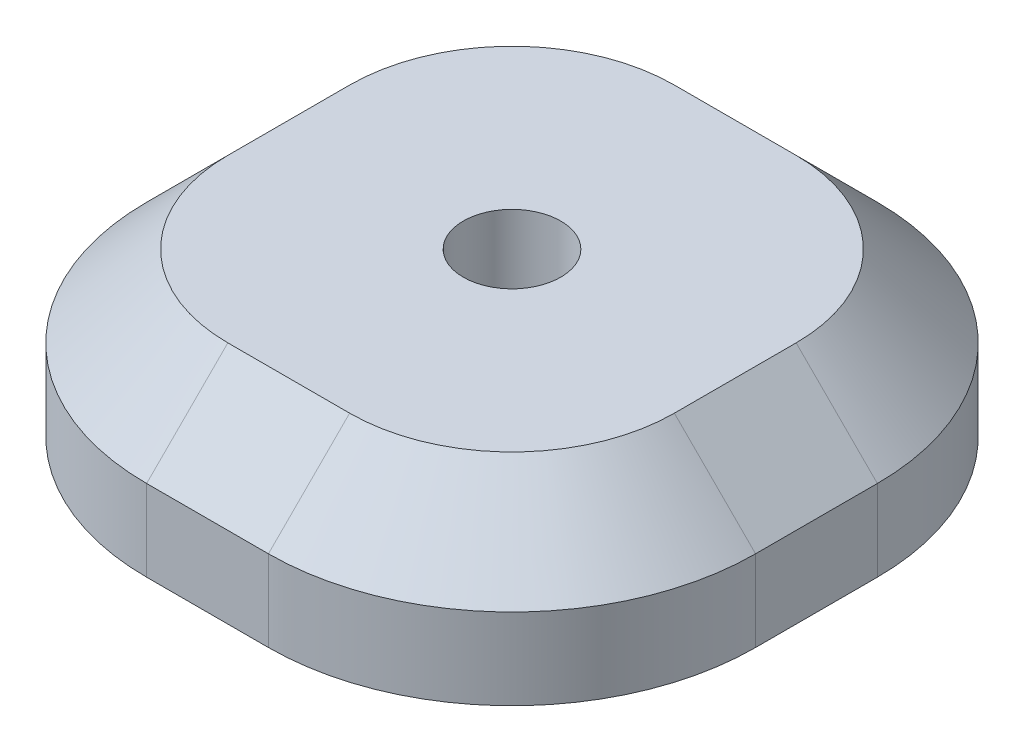
ISO-10303-21;
HEADER;
FILE_DESCRIPTION(('STEP AP214'),'2;1');
FILE_NAME('part.step','',(''),(''),'','','');
FILE_SCHEMA(('AUTOMOTIVE_DESIGN { 1 0 10303 214 1 1 1 1 }'));
ENDSEC;
DATA;
#1=APPLICATION_CONTEXT('core data for automotive mechanical design processes');
#2=APPLICATION_PROTOCOL_DEFINITION('international standard','automotive_design',2000,#1);
#3=PRODUCT_CONTEXT('',#1,'mechanical');
#4=PRODUCT('Part','Part','',(#3));
#5=PRODUCT_RELATED_PRODUCT_CATEGORY('part','',(#4));
#6=PRODUCT_DEFINITION_FORMATION('','',#4);
#7=PRODUCT_DEFINITION_CONTEXT('part definition',#1,'design');
#8=PRODUCT_DEFINITION('design','',#6,#7);
#9=PRODUCT_DEFINITION_SHAPE('','',#8);
#10=(LENGTH_UNIT() NAMED_UNIT(*) SI_UNIT(.MILLI.,.METRE.));
#11=(NAMED_UNIT(*) PLANE_ANGLE_UNIT() SI_UNIT($,.RADIAN.));
#12=(NAMED_UNIT(*) SI_UNIT($,.STERADIAN.) SOLID_ANGLE_UNIT());
#13=UNCERTAINTY_MEASURE_WITH_UNIT(LENGTH_MEASURE(1.E-05),#10,'distance_accuracy_value','');
#14=(GEOMETRIC_REPRESENTATION_CONTEXT(3) GLOBAL_UNCERTAINTY_ASSIGNED_CONTEXT((#13)) GLOBAL_UNIT_ASSIGNED_CONTEXT((#10,
#11,#12)) REPRESENTATION_CONTEXT('',''));
#15=CARTESIAN_POINT('',(0.,0.,0.));
#16=DIRECTION('',(0.,0.,1.));
#17=DIRECTION('',(1.,0.,0.));
#18=AXIS2_PLACEMENT_3D('',#15,#16,#17);
#19=CARTESIAN_POINT('',(7.50000000000001,20.,-7.50000000000002));
#20=DIRECTION('',(0.,-1.,0.));
#21=DIRECTION('',(0.,0.,-1.));
#22=AXIS2_PLACEMENT_3D('',#19,#20,#21);
#23=CYLINDRICAL_SURFACE('',#22,30.);
#24=DIRECTION('',(0.,-1.,0.));
#25=VECTOR('',#24,1.);
#26=CARTESIAN_POINT('',(7.50000000000001,20.,-37.5));
#27=LINE('',#26,#25);
#28=CARTESIAN_POINT('',(7.50000000000001,9.99999999999995,-37.5));
#29=VERTEX_POINT('',#28);
#30=CARTESIAN_POINT('',(7.50000000000001,0.,-37.5));
#31=VERTEX_POINT('',#30);
#32=EDGE_CURVE('E217',#29,#31,#27,.T.);
#33=ORIENTED_EDGE('',*,*,#32,.F.);
#34=CARTESIAN_POINT('',(7.50000000000001,9.99999999999995,-7.50000000000002));
#35=DIRECTION('',(0.,1.,0.));
#36=DIRECTION('',(0.,0.,1.));
#37=AXIS2_PLACEMENT_3D('',#34,#35,#36);
#38=CIRCLE('',#37,30.);
#39=CARTESIAN_POINT('',(37.5,9.99999999999995,-7.50000000000002));
#40=VERTEX_POINT('',#39);
#41=EDGE_CURVE('E241',#29,#40,#38,.F.);
#42=ORIENTED_EDGE('',*,*,#41,.T.);
#43=DIRECTION('',(0.,-1.,0.));
#44=VECTOR('',#43,1.);
#45=CARTESIAN_POINT('',(37.5,20.,-7.50000000000002));
#46=LINE('',#45,#44);
#47=CARTESIAN_POINT('',(37.5,0.,-7.50000000000002));
#48=VERTEX_POINT('',#47);
#49=EDGE_CURVE('E203',#40,#48,#46,.T.);
#50=ORIENTED_EDGE('',*,*,#49,.T.);
#51=CARTESIAN_POINT('',(7.50000000000001,0.,-7.50000000000002));
#52=DIRECTION('',(0.,1.,0.));
#53=DIRECTION('',(0.,0.,1.));
#54=AXIS2_PLACEMENT_3D('',#51,#52,#53);
#55=CIRCLE('',#54,30.);
#56=EDGE_CURVE('E179',#48,#31,#55,.T.);
#57=ORIENTED_EDGE('',*,*,#56,.T.);
#58=EDGE_LOOP('',(#33,#42,#50,#57));
#59=FACE_BOUND('',#58,.T.);
#60=ADVANCED_FACE('F35',(#59),#23,.T.);
#61=CARTESIAN_POINT('',(7.50000000000001,20.,-37.5));
#62=DIRECTION('',(0.,0.,1.));
#63=DIRECTION('',(1.,0.,0.));
#64=AXIS2_PLACEMENT_3D('',#61,#62,#63);
#65=PLANE('',#64);
#66=DIRECTION('',(0.,-1.,0.));
#67=VECTOR('',#66,1.);
#68=CARTESIAN_POINT('',(-7.5,20.,-37.5));
#69=LINE('',#68,#67);
#70=CARTESIAN_POINT('',(-7.5,9.99999999999995,-37.5));
#71=VERTEX_POINT('',#70);
#72=CARTESIAN_POINT('',(-7.5,0.,-37.5));
#73=VERTEX_POINT('',#72);
#74=EDGE_CURVE('E215',#71,#73,#69,.T.);
#75=ORIENTED_EDGE('',*,*,#74,.F.);
#76=DIRECTION('',(1.,0.,0.));
#77=VECTOR('',#76,1.);
#78=CARTESIAN_POINT('',(7.50000000000001,9.99999999999995,-37.5));
#79=LINE('',#78,#77);
#80=EDGE_CURVE('E239',#71,#29,#79,.T.);
#81=ORIENTED_EDGE('',*,*,#80,.T.);
#82=ORIENTED_EDGE('',*,*,#32,.T.);
#83=DIRECTION('',(-1.,0.,0.));
#84=VECTOR('',#83,1.);
#85=CARTESIAN_POINT('',(7.50000000000001,0.,-37.5));
#86=LINE('',#85,#84);
#87=EDGE_CURVE('E182',#31,#73,#86,.T.);
#88=ORIENTED_EDGE('',*,*,#87,.T.);
#89=EDGE_LOOP('',(#75,#81,#82,#88));
#90=FACE_BOUND('',#89,.T.);
#91=ADVANCED_FACE('F344',(#90),#65,.F.);
#92=CARTESIAN_POINT('',(-7.50000000000001,20.,-7.50000000000001));
#93=DIRECTION('',(0.,-1.,0.));
#94=DIRECTION('',(0.,0.,-1.));
#95=AXIS2_PLACEMENT_3D('',#92,#93,#94);
#96=CYLINDRICAL_SURFACE('',#95,30.);
#97=DIRECTION('',(0.,-1.,0.));
#98=VECTOR('',#97,1.);
#99=CARTESIAN_POINT('',(-37.5,20.,-7.50000000000002));
#100=LINE('',#99,#98);
#101=CARTESIAN_POINT('',(-37.5,9.99999999999995,-7.50000000000002));
#102=VERTEX_POINT('',#101);
#103=CARTESIAN_POINT('',(-37.5,0.,-7.50000000000002));
#104=VERTEX_POINT('',#103);
#105=EDGE_CURVE('E213',#102,#104,#100,.T.);
#106=ORIENTED_EDGE('',*,*,#105,.F.);
#107=CARTESIAN_POINT('',(-7.50000000000001,9.99999999999995,-7.50000000000001));
#108=DIRECTION('',(0.,1.,0.));
#109=DIRECTION('',(0.,0.,1.));
#110=AXIS2_PLACEMENT_3D('',#107,#108,#109);
#111=CIRCLE('',#110,30.);
#112=EDGE_CURVE('E236',#102,#71,#111,.F.);
#113=ORIENTED_EDGE('',*,*,#112,.T.);
#114=ORIENTED_EDGE('',*,*,#74,.T.);
#115=CARTESIAN_POINT('',(-7.50000000000001,0.,-7.50000000000001));
#116=DIRECTION('',(0.,1.,0.));
#117=DIRECTION('',(0.,0.,1.));
#118=AXIS2_PLACEMENT_3D('',#115,#116,#117);
#119=CIRCLE('',#118,30.);
#120=EDGE_CURVE('E185',#73,#104,#119,.T.);
#121=ORIENTED_EDGE('',*,*,#120,.T.);
#122=EDGE_LOOP('',(#106,#113,#114,#121));
#123=FACE_BOUND('',#122,.T.);
#124=ADVANCED_FACE('F324',(#123),#96,.T.);
#125=CARTESIAN_POINT('',(-37.5,20.,7.50000000000001));
#126=DIRECTION('',(1.,0.,0.));
#127=DIRECTION('',(0.,0.,-1.));
#128=AXIS2_PLACEMENT_3D('',#125,#126,#127);
#129=PLANE('',#128);
#130=DIRECTION('',(0.,-1.,0.));
#131=VECTOR('',#130,1.);
#132=CARTESIAN_POINT('',(-37.5,20.,7.50000000000001));
#133=LINE('',#132,#131);
#134=CARTESIAN_POINT('',(-37.5,9.99999999999995,7.50000000000001));
#135=VERTEX_POINT('',#134);
#136=CARTESIAN_POINT('',(-37.5,0.,7.50000000000001));
#137=VERTEX_POINT('',#136);
#138=EDGE_CURVE('E211',#135,#137,#133,.T.);
#139=ORIENTED_EDGE('',*,*,#138,.F.);
#140=DIRECTION('',(0.,0.,-1.));
#141=VECTOR('',#140,1.);
#142=CARTESIAN_POINT('',(-37.5,9.99999999999995,-7.50000000000002));
#143=LINE('',#142,#141);
#144=EDGE_CURVE('E11',#135,#102,#143,.T.);
#145=ORIENTED_EDGE('',*,*,#144,.T.);
#146=ORIENTED_EDGE('',*,*,#105,.T.);
#147=DIRECTION('',(0.,0.,1.));
#148=VECTOR('',#147,1.);
#149=CARTESIAN_POINT('',(-37.5,0.,7.50000000000001));
#150=LINE('',#149,#148);
#151=EDGE_CURVE('E188',#104,#137,#150,.T.);
#152=ORIENTED_EDGE('',*,*,#151,.T.);
#153=EDGE_LOOP('',(#139,#145,#146,#152));
#154=FACE_BOUND('',#153,.T.);
#155=ADVANCED_FACE('F321',(#154),#129,.F.);
#156=CARTESIAN_POINT('',(-7.50000000000001,20.,7.50000000000001));
#157=DIRECTION('',(0.,-1.,0.));
#158=DIRECTION('',(0.,0.,-1.));
#159=AXIS2_PLACEMENT_3D('',#156,#157,#158);
#160=CYLINDRICAL_SURFACE('',#159,30.);
#161=DIRECTION('',(0.,-1.,0.));
#162=VECTOR('',#161,1.);
#163=CARTESIAN_POINT('',(-7.50000000000001,20.,37.5));
#164=LINE('',#163,#162);
#165=CARTESIAN_POINT('',(-7.50000000000001,9.99999999999995,37.5));
#166=VERTEX_POINT('',#165);
#167=CARTESIAN_POINT('',(-7.50000000000001,0.,37.5));
#168=VERTEX_POINT('',#167);
#169=EDGE_CURVE('E209',#166,#168,#164,.T.);
#170=ORIENTED_EDGE('',*,*,#169,.F.);
#171=CARTESIAN_POINT('',(-7.50000000000001,9.99999999999995,7.50000000000001));
#172=DIRECTION('',(0.,1.,0.));
#173=DIRECTION('',(0.,0.,1.));
#174=AXIS2_PLACEMENT_3D('',#171,#172,#173);
#175=CIRCLE('',#174,30.);
#176=EDGE_CURVE('E45',#166,#135,#175,.F.);
#177=ORIENTED_EDGE('',*,*,#176,.T.);
#178=ORIENTED_EDGE('',*,*,#138,.T.);
#179=CARTESIAN_POINT('',(-7.50000000000001,0.,7.50000000000001));
#180=DIRECTION('',(0.,1.,0.));
#181=DIRECTION('',(0.,0.,-1.));
#182=AXIS2_PLACEMENT_3D('',#179,#180,#181);
#183=CIRCLE('',#182,30.);
#184=EDGE_CURVE('E191',#137,#168,#183,.T.);
#185=ORIENTED_EDGE('',*,*,#184,.T.);
#186=EDGE_LOOP('',(#170,#177,#178,#185));
#187=FACE_BOUND('',#186,.T.);
#188=ADVANCED_FACE('F355',(#187),#160,.T.);
#189=CARTESIAN_POINT('',(7.50000000000003,20.,37.5));
#190=DIRECTION('',(0.,0.,-1.));
#191=DIRECTION('',(-1.,0.,0.));
#192=AXIS2_PLACEMENT_3D('',#189,#190,#191);
#193=PLANE('',#192);
#194=DIRECTION('',(0.,-1.,0.));
#195=VECTOR('',#194,1.);
#196=CARTESIAN_POINT('',(7.50000000000003,20.,37.5));
#197=LINE('',#196,#195);
#198=CARTESIAN_POINT('',(7.50000000000003,9.99999999999995,37.5));
#199=VERTEX_POINT('',#198);
#200=CARTESIAN_POINT('',(7.50000000000003,0.,37.5));
#201=VERTEX_POINT('',#200);
#202=EDGE_CURVE('E207',#199,#201,#197,.T.);
#203=ORIENTED_EDGE('',*,*,#202,.F.);
#204=DIRECTION('',(-1.,0.,0.));
#205=VECTOR('',#204,1.);
#206=CARTESIAN_POINT('',(-7.50000000000001,9.99999999999995,37.5));
#207=LINE('',#206,#205);
#208=EDGE_CURVE('E60',#199,#166,#207,.T.);
#209=ORIENTED_EDGE('',*,*,#208,.T.);
#210=ORIENTED_EDGE('',*,*,#169,.T.);
#211=DIRECTION('',(1.,0.,0.));
#212=VECTOR('',#211,1.);
#213=CARTESIAN_POINT('',(7.50000000000003,0.,37.5));
#214=LINE('',#213,#212);
#215=EDGE_CURVE('E194',#168,#201,#214,.T.);
#216=ORIENTED_EDGE('',*,*,#215,.T.);
#217=EDGE_LOOP('',(#203,#209,#210,#216));
#218=FACE_BOUND('',#217,.T.);
#219=ADVANCED_FACE('F281',(#218),#193,.F.);
#220=CARTESIAN_POINT('',(7.50000000000003,20.,7.5));
#221=DIRECTION('',(0.,-1.,0.));
#222=DIRECTION('',(0.,0.,-1.));
#223=AXIS2_PLACEMENT_3D('',#220,#221,#222);
#224=CYLINDRICAL_SURFACE('',#223,30.);
#225=DIRECTION('',(0.,-1.,0.));
#226=VECTOR('',#225,1.);
#227=CARTESIAN_POINT('',(37.5,20.,7.5));
#228=LINE('',#227,#226);
#229=CARTESIAN_POINT('',(37.5,9.99999999999995,7.5));
#230=VERTEX_POINT('',#229);
#231=CARTESIAN_POINT('',(37.5,0.,7.5));
#232=VERTEX_POINT('',#231);
#233=EDGE_CURVE('E205',#230,#232,#228,.T.);
#234=ORIENTED_EDGE('',*,*,#233,.F.);
#235=CARTESIAN_POINT('',(7.50000000000003,9.99999999999995,7.5));
#236=DIRECTION('',(0.,1.,0.));
#237=DIRECTION('',(0.,0.,1.));
#238=AXIS2_PLACEMENT_3D('',#235,#236,#237);
#239=CIRCLE('',#238,30.);
#240=EDGE_CURVE('E245',#230,#199,#239,.F.);
#241=ORIENTED_EDGE('',*,*,#240,.T.);
#242=ORIENTED_EDGE('',*,*,#202,.T.);
#243=CARTESIAN_POINT('',(7.50000000000003,0.,7.5));
#244=DIRECTION('',(0.,1.,0.));
#245=DIRECTION('',(0.,0.,1.));
#246=AXIS2_PLACEMENT_3D('',#243,#244,#245);
#247=CIRCLE('',#246,30.);
#248=EDGE_CURVE('E197',#201,#232,#247,.T.);
#249=ORIENTED_EDGE('',*,*,#248,.T.);
#250=EDGE_LOOP('',(#234,#241,#242,#249));
#251=FACE_BOUND('',#250,.T.);
#252=ADVANCED_FACE('F280',(#251),#224,.T.);
#253=CARTESIAN_POINT('',(37.5,20.,7.5));
#254=DIRECTION('',(-1.,0.,0.));
#255=DIRECTION('',(0.,0.,1.));
#256=AXIS2_PLACEMENT_3D('',#253,#254,#255);
#257=PLANE('',#256);
#258=ORIENTED_EDGE('',*,*,#49,.F.);
#259=DIRECTION('',(0.,0.,1.));
#260=VECTOR('',#259,1.);
#261=CARTESIAN_POINT('',(37.5,9.99999999999995,7.5));
#262=LINE('',#261,#260);
#263=EDGE_CURVE('E243',#40,#230,#262,.T.);
#264=ORIENTED_EDGE('',*,*,#263,.T.);
#265=ORIENTED_EDGE('',*,*,#233,.T.);
#266=DIRECTION('',(0.,0.,-1.));
#267=VECTOR('',#266,1.);
#268=CARTESIAN_POINT('',(37.5,0.,7.5));
#269=LINE('',#268,#267);
#270=EDGE_CURVE('E200',#232,#48,#269,.T.);
#271=ORIENTED_EDGE('',*,*,#270,.T.);
#272=EDGE_LOOP('',(#258,#264,#265,#271));
#273=FACE_BOUND('',#272,.T.);
#274=ADVANCED_FACE('F292',(#273),#257,.F.);
#275=CARTESIAN_POINT('',(7.50000000000001,20.,-7.50000000000002));
#276=DIRECTION('',(0.,1.,0.));
#277=DIRECTION('',(0.,0.,1.));
#278=AXIS2_PLACEMENT_3D('',#275,#276,#277);
#279=PLANE('',#278);
#280=CARTESIAN_POINT('',(0.,20.,0.));
#281=DIRECTION('',(0.,1.,0.));
#282=DIRECTION('',(0.,0.,1.));
#283=AXIS2_PLACEMENT_3D('',#280,#281,#282);
#284=CIRCLE('',#283,5.99999999999999);
#285=CARTESIAN_POINT('',(0.,20.,5.99999999999999));
#286=VERTEX_POINT('',#285);
#287=EDGE_CURVE('E150',#286,#286,#284,.T.);
#288=ORIENTED_EDGE('',*,*,#287,.F.);
#289=EDGE_LOOP('',(#288));
#290=FACE_BOUND('',#289,.T.);
#291=DIRECTION('',(-1.,0.,0.));
#292=VECTOR('',#291,1.);
#293=CARTESIAN_POINT('',(-7.5,20.,-27.5));
#294=LINE('',#293,#292);
#295=CARTESIAN_POINT('',(7.50000000000001,20.,-27.5));
#296=VERTEX_POINT('',#295);
#297=CARTESIAN_POINT('',(-7.5,20.,-27.5));
#298=VERTEX_POINT('',#297);
#299=EDGE_CURVE('E231',#296,#298,#294,.T.);
#300=ORIENTED_EDGE('',*,*,#299,.T.);
#301=CARTESIAN_POINT('',(-7.50000000000001,20.,-7.50000000000001));
#302=DIRECTION('',(0.,1.,0.));
#303=DIRECTION('',(0.,0.,1.));
#304=AXIS2_PLACEMENT_3D('',#301,#302,#303);
#305=CIRCLE('',#304,20.);
#306=CARTESIAN_POINT('',(-27.5,20.,-7.50000000000002));
#307=VERTEX_POINT('',#306);
#308=EDGE_CURVE('E233',#298,#307,#305,.T.);
#309=ORIENTED_EDGE('',*,*,#308,.T.);
#310=DIRECTION('',(0.,0.,1.));
#311=VECTOR('',#310,1.);
#312=CARTESIAN_POINT('',(-27.5,20.,7.50000000000002));
#313=LINE('',#312,#311);
#314=CARTESIAN_POINT('',(-27.5,20.,7.50000000000001));
#315=VERTEX_POINT('',#314);
#316=EDGE_CURVE('E219',#307,#315,#313,.T.);
#317=ORIENTED_EDGE('',*,*,#316,.T.);
#318=CARTESIAN_POINT('',(-7.50000000000001,20.,7.50000000000001));
#319=DIRECTION('',(0.,1.,0.));
#320=DIRECTION('',(0.,0.,1.));
#321=AXIS2_PLACEMENT_3D('',#318,#319,#320);
#322=CIRCLE('',#321,20.);
#323=CARTESIAN_POINT('',(-7.50000000000002,20.,27.5));
#324=VERTEX_POINT('',#323);
#325=EDGE_CURVE('E221',#315,#324,#322,.T.);
#326=ORIENTED_EDGE('',*,*,#325,.T.);
#327=DIRECTION('',(1.,0.,0.));
#328=VECTOR('',#327,1.);
#329=CARTESIAN_POINT('',(7.50000000000003,20.,27.5));
#330=LINE('',#329,#328);
#331=CARTESIAN_POINT('',(7.50000000000003,20.,27.5));
#332=VERTEX_POINT('',#331);
#333=EDGE_CURVE('E223',#324,#332,#330,.T.);
#334=ORIENTED_EDGE('',*,*,#333,.T.);
#335=CARTESIAN_POINT('',(7.50000000000003,20.,7.5));
#336=DIRECTION('',(0.,1.,0.));
#337=DIRECTION('',(0.,0.,1.));
#338=AXIS2_PLACEMENT_3D('',#335,#336,#337);
#339=CIRCLE('',#338,20.);
#340=CARTESIAN_POINT('',(27.5,20.,7.5));
#341=VERTEX_POINT('',#340);
#342=EDGE_CURVE('E225',#332,#341,#339,.T.);
#343=ORIENTED_EDGE('',*,*,#342,.T.);
#344=DIRECTION('',(0.,0.,-1.));
#345=VECTOR('',#344,1.);
#346=CARTESIAN_POINT('',(27.5,20.,-7.50000000000002));
#347=LINE('',#346,#345);
#348=CARTESIAN_POINT('',(27.5,20.,-7.50000000000002));
#349=VERTEX_POINT('',#348);
#350=EDGE_CURVE('E227',#341,#349,#347,.T.);
#351=ORIENTED_EDGE('',*,*,#350,.T.);
#352=CARTESIAN_POINT('',(7.50000000000001,20.,-7.50000000000002));
#353=DIRECTION('',(0.,1.,0.));
#354=DIRECTION('',(0.,0.,1.));
#355=AXIS2_PLACEMENT_3D('',#352,#353,#354);
#356=CIRCLE('',#355,20.);
#357=EDGE_CURVE('E229',#349,#296,#356,.T.);
#358=ORIENTED_EDGE('',*,*,#357,.T.);
#359=EDGE_LOOP('',(#300,#309,#317,#326,#334,#343,#351,#358));
#360=FACE_BOUND('',#359,.T.);
#361=ADVANCED_FACE('F307',(#290,#360),#279,.T.);
#362=CARTESIAN_POINT('',(7.50000000000001,0.,-7.50000000000002));
#363=DIRECTION('',(0.,1.,0.));
#364=DIRECTION('',(0.,0.,1.));
#365=AXIS2_PLACEMENT_3D('',#362,#363,#364);
#366=PLANE('',#365);
#367=CARTESIAN_POINT('',(-12.5,0.,12.5));
#368=DIRECTION('',(0.,-1.,0.));
#369=DIRECTION('',(0.,0.,-1.));
#370=AXIS2_PLACEMENT_3D('',#367,#368,#369);
#371=CIRCLE('',#370,5.99999999999999);
#372=CARTESIAN_POINT('',(-12.5,0.,6.50000000000001));
#373=VERTEX_POINT('',#372);
#374=EDGE_CURVE('E149',#373,#373,#371,.T.);
#375=ORIENTED_EDGE('',*,*,#374,.F.);
#376=EDGE_LOOP('',(#375));
#377=FACE_BOUND('',#376,.T.);
#378=CARTESIAN_POINT('',(12.5,0.,12.5));
#379=DIRECTION('',(0.,-1.,0.));
#380=DIRECTION('',(0.,0.,-1.));
#381=AXIS2_PLACEMENT_3D('',#378,#379,#380);
#382=CIRCLE('',#381,5.99999999999999);
#383=CARTESIAN_POINT('',(12.5,0.,6.50000000000001));
#384=VERTEX_POINT('',#383);
#385=EDGE_CURVE('E160',#384,#384,#382,.T.);
#386=ORIENTED_EDGE('',*,*,#385,.F.);
#387=EDGE_LOOP('',(#386));
#388=FACE_BOUND('',#387,.T.);
#389=CARTESIAN_POINT('',(12.5,0.,-12.5));
#390=DIRECTION('',(0.,-1.,0.));
#391=DIRECTION('',(0.,0.,-1.));
#392=AXIS2_PLACEMENT_3D('',#389,#390,#391);
#393=CIRCLE('',#392,5.99999999999999);
#394=CARTESIAN_POINT('',(12.5,0.,-18.5));
#395=VERTEX_POINT('',#394);
#396=EDGE_CURVE('E166',#395,#395,#393,.T.);
#397=ORIENTED_EDGE('',*,*,#396,.F.);
#398=EDGE_LOOP('',(#397));
#399=FACE_BOUND('',#398,.T.);
#400=CARTESIAN_POINT('',(-12.5,0.,-12.5));
#401=DIRECTION('',(0.,-1.,0.));
#402=DIRECTION('',(0.,0.,-1.));
#403=AXIS2_PLACEMENT_3D('',#400,#401,#402);
#404=CIRCLE('',#403,5.99999999999999);
#405=CARTESIAN_POINT('',(-12.5,0.,-18.5));
#406=VERTEX_POINT('',#405);
#407=EDGE_CURVE('E172',#406,#406,#404,.T.);
#408=ORIENTED_EDGE('',*,*,#407,.F.);
#409=EDGE_LOOP('',(#408));
#410=FACE_BOUND('',#409,.T.);
#411=ORIENTED_EDGE('',*,*,#56,.F.);
#412=ORIENTED_EDGE('',*,*,#270,.F.);
#413=ORIENTED_EDGE('',*,*,#248,.F.);
#414=ORIENTED_EDGE('',*,*,#215,.F.);
#415=ORIENTED_EDGE('',*,*,#184,.F.);
#416=ORIENTED_EDGE('',*,*,#151,.F.);
#417=ORIENTED_EDGE('',*,*,#120,.F.);
#418=ORIENTED_EDGE('',*,*,#87,.F.);
#419=EDGE_LOOP('',(#411,#412,#413,#414,#415,#416,#417,#418));
#420=FACE_BOUND('',#419,.T.);
#421=ADVANCED_FACE('F288',(#377,#388,#399,#410,#420),#366,.F.);
#422=CARTESIAN_POINT('',(7.50000000000003,20.,7.5));
#423=DIRECTION('',(0.,-1.,0.));
#424=DIRECTION('',(0.,0.,-1.));
#425=AXIS2_PLACEMENT_3D('',#422,#423,#424);
#426=CONICAL_SURFACE('',#425,20.,0.785398163397446);
#427=DIRECTION('',(0.,0.707106781186549,-0.707106781186546));
#428=VECTOR('',#427,1.);
#429=CARTESIAN_POINT('',(7.50000000000003,9.99999999999995,37.5));
#430=LINE('',#429,#428);
#431=EDGE_CURVE('E263',#199,#332,#430,.T.);
#432=ORIENTED_EDGE('',*,*,#431,.F.);
#433=ORIENTED_EDGE('',*,*,#240,.F.);
#434=DIRECTION('',(0.707106781186546,-0.707106781186549,0.));
#435=VECTOR('',#434,1.);
#436=CARTESIAN_POINT('',(27.5,20.,7.5));
#437=LINE('',#436,#435);
#438=EDGE_CURVE('E40',#341,#230,#437,.T.);
#439=ORIENTED_EDGE('',*,*,#438,.F.);
#440=ORIENTED_EDGE('',*,*,#342,.F.);
#441=EDGE_LOOP('',(#432,#433,#439,#440));
#442=FACE_BOUND('',#441,.T.);
#443=ADVANCED_FACE('F38',(#442),#426,.T.);
#444=CARTESIAN_POINT('',(27.5,20.,-7.50000000000002));
#445=DIRECTION('',(0.707106781186549,0.707106781186546,0.));
#446=DIRECTION('',(0.,0.,1.));
#447=AXIS2_PLACEMENT_3D('',#444,#445,#446);
#448=PLANE('',#447);
#449=ORIENTED_EDGE('',*,*,#438,.T.);
#450=ORIENTED_EDGE('',*,*,#263,.F.);
#451=DIRECTION('',(0.707106781186546,-0.707106781186549,0.));
#452=VECTOR('',#451,1.);
#453=CARTESIAN_POINT('',(27.5,20.,-7.50000000000002));
#454=LINE('',#453,#452);
#455=EDGE_CURVE('E261',#349,#40,#454,.T.);
#456=ORIENTED_EDGE('',*,*,#455,.F.);
#457=ORIENTED_EDGE('',*,*,#350,.F.);
#458=EDGE_LOOP('',(#449,#450,#456,#457));
#459=FACE_BOUND('',#458,.T.);
#460=ADVANCED_FACE('F273',(#459),#448,.T.);
#461=CARTESIAN_POINT('',(7.50000000000005,20.,27.5));
#462=DIRECTION('',(0.,0.707106781186546,0.707106781186549));
#463=DIRECTION('',(-1.,0.,0.));
#464=AXIS2_PLACEMENT_3D('',#461,#462,#463);
#465=PLANE('',#464);
#466=ORIENTED_EDGE('',*,*,#431,.T.);
#467=ORIENTED_EDGE('',*,*,#333,.F.);
#468=DIRECTION('',(0.,0.707106781186549,-0.707106781186546));
#469=VECTOR('',#468,1.);
#470=CARTESIAN_POINT('',(-7.50000000000001,9.99999999999995,37.5));
#471=LINE('',#470,#469);
#472=EDGE_CURVE('E258',#166,#324,#471,.T.);
#473=ORIENTED_EDGE('',*,*,#472,.F.);
#474=ORIENTED_EDGE('',*,*,#208,.F.);
#475=EDGE_LOOP('',(#466,#467,#473,#474));
#476=FACE_BOUND('',#475,.T.);
#477=ADVANCED_FACE('F310',(#476),#465,.T.);
#478=CARTESIAN_POINT('',(7.50000000000001,20.,-7.50000000000002));
#479=DIRECTION('',(0.,-1.,0.));
#480=DIRECTION('',(0.,0.,-1.));
#481=AXIS2_PLACEMENT_3D('',#478,#479,#480);
#482=CONICAL_SURFACE('',#481,20.,0.785398163397446);
#483=ORIENTED_EDGE('',*,*,#455,.T.);
#484=ORIENTED_EDGE('',*,*,#41,.F.);
#485=DIRECTION('',(0.,-0.707106781186549,-0.707106781186546));
#486=VECTOR('',#485,1.);
#487=CARTESIAN_POINT('',(7.50000000000001,20.,-27.5));
#488=LINE('',#487,#486);
#489=EDGE_CURVE('E255',#296,#29,#488,.T.);
#490=ORIENTED_EDGE('',*,*,#489,.F.);
#491=ORIENTED_EDGE('',*,*,#357,.F.);
#492=EDGE_LOOP('',(#483,#484,#490,#491));
#493=FACE_BOUND('',#492,.T.);
#494=ADVANCED_FACE('F298',(#493),#482,.T.);
#495=CARTESIAN_POINT('',(-7.50000000000001,20.,7.50000000000001));
#496=DIRECTION('',(0.,-1.,0.));
#497=DIRECTION('',(0.,0.,-1.));
#498=AXIS2_PLACEMENT_3D('',#495,#496,#497);
#499=CONICAL_SURFACE('',#498,20.,0.785398163397446);
#500=ORIENTED_EDGE('',*,*,#472,.T.);
#501=ORIENTED_EDGE('',*,*,#325,.F.);
#502=DIRECTION('',(0.707106781186546,0.707106781186549,0.));
#503=VECTOR('',#502,1.);
#504=CARTESIAN_POINT('',(-37.5,9.99999999999995,7.50000000000001));
#505=LINE('',#504,#503);
#506=EDGE_CURVE('E252',#135,#315,#505,.T.);
#507=ORIENTED_EDGE('',*,*,#506,.F.);
#508=ORIENTED_EDGE('',*,*,#176,.F.);
#509=EDGE_LOOP('',(#500,#501,#507,#508));
#510=FACE_BOUND('',#509,.T.);
#511=ADVANCED_FACE('F312',(#510),#499,.T.);
#512=CARTESIAN_POINT('',(7.50000000000001,20.,-27.5));
#513=DIRECTION('',(0.,0.707106781186546,-0.707106781186549));
#514=DIRECTION('',(1.,0.,0.));
#515=AXIS2_PLACEMENT_3D('',#512,#513,#514);
#516=PLANE('',#515);
#517=ORIENTED_EDGE('',*,*,#489,.T.);
#518=ORIENTED_EDGE('',*,*,#80,.F.);
#519=DIRECTION('',(0.,-0.707106781186549,-0.707106781186546));
#520=VECTOR('',#519,1.);
#521=CARTESIAN_POINT('',(-7.5,20.,-27.5));
#522=LINE('',#521,#520);
#523=EDGE_CURVE('E250',#298,#71,#522,.T.);
#524=ORIENTED_EDGE('',*,*,#523,.F.);
#525=ORIENTED_EDGE('',*,*,#299,.F.);
#526=EDGE_LOOP('',(#517,#518,#524,#525));
#527=FACE_BOUND('',#526,.T.);
#528=ADVANCED_FACE('F303',(#527),#516,.T.);
#529=CARTESIAN_POINT('',(-27.5,20.,-7.50000000000004));
#530=DIRECTION('',(-0.707106781186549,0.707106781186546,0.));
#531=DIRECTION('',(0.,0.,-1.));
#532=AXIS2_PLACEMENT_3D('',#529,#530,#531);
#533=PLANE('',#532);
#534=ORIENTED_EDGE('',*,*,#506,.T.);
#535=ORIENTED_EDGE('',*,*,#316,.F.);
#536=DIRECTION('',(0.707106781186546,0.707106781186549,0.));
#537=VECTOR('',#536,1.);
#538=CARTESIAN_POINT('',(-37.5,9.99999999999995,-7.50000000000002));
#539=LINE('',#538,#537);
#540=EDGE_CURVE('E178',#102,#307,#539,.T.);
#541=ORIENTED_EDGE('',*,*,#540,.F.);
#542=ORIENTED_EDGE('',*,*,#144,.F.);
#543=EDGE_LOOP('',(#534,#535,#541,#542));
#544=FACE_BOUND('',#543,.T.);
#545=ADVANCED_FACE('F318',(#544),#533,.T.);
#546=CARTESIAN_POINT('',(-7.50000000000001,20.,-7.50000000000001));
#547=DIRECTION('',(0.,-1.,0.));
#548=DIRECTION('',(0.,0.,-1.));
#549=AXIS2_PLACEMENT_3D('',#546,#547,#548);
#550=CONICAL_SURFACE('',#549,20.,0.785398163397446);
#551=ORIENTED_EDGE('',*,*,#523,.T.);
#552=ORIENTED_EDGE('',*,*,#112,.F.);
#553=ORIENTED_EDGE('',*,*,#540,.T.);
#554=ORIENTED_EDGE('',*,*,#308,.F.);
#555=EDGE_LOOP('',(#551,#552,#553,#554));
#556=FACE_BOUND('',#555,.T.);
#557=ADVANCED_FACE('F329',(#556),#550,.T.);
#558=CARTESIAN_POINT('',(-12.5,9.99999999999999,-12.5));
#559=DIRECTION('',(0.,-1.,0.));
#560=DIRECTION('',(0.,0.,-1.));
#561=AXIS2_PLACEMENT_3D('',#558,#559,#560);
#562=CONICAL_SURFACE('',#561,5.99999999999999,1.02974425867666);
#563=CARTESIAN_POINT('',(-12.5,13.6051637141653,-12.5));
#564=VERTEX_POINT('',#563);
#565=VERTEX_LOOP('',#564);
#566=FACE_BOUND('',#565,.T.);
#567=CARTESIAN_POINT('',(-12.5,9.99999999999999,-12.5));
#568=DIRECTION('',(0.,-1.,0.));
#569=DIRECTION('',(0.,0.,-1.));
#570=AXIS2_PLACEMENT_3D('',#567,#568,#569);
#571=CIRCLE('',#570,5.99999999999999);
#572=CARTESIAN_POINT('',(-12.5,9.99999999999999,-18.5));
#573=VERTEX_POINT('',#572);
#574=EDGE_CURVE('E175',#573,#573,#571,.T.);
#575=ORIENTED_EDGE('',*,*,#574,.T.);
#576=EDGE_LOOP('',(#575));
#577=FACE_BOUND('',#576,.T.);
#578=ADVANCED_FACE('F331',(#566,#577),#562,.F.);
#579=CARTESIAN_POINT('',(-12.5,0.,-12.5));
#580=DIRECTION('',(0.,-1.,0.));
#581=DIRECTION('',(0.,0.,-1.));
#582=AXIS2_PLACEMENT_3D('',#579,#580,#581);
#583=CYLINDRICAL_SURFACE('',#582,5.99999999999999);
#584=ORIENTED_EDGE('',*,*,#574,.F.);
#585=EDGE_LOOP('',(#584));
#586=FACE_BOUND('',#585,.T.);
#587=ORIENTED_EDGE('',*,*,#407,.T.);
#588=EDGE_LOOP('',(#587));
#589=FACE_BOUND('',#588,.T.);
#590=ADVANCED_FACE('F337',(#586,#589),#583,.F.);
#591=CARTESIAN_POINT('',(12.5,9.99999999999999,-12.5));
#592=DIRECTION('',(0.,-1.,0.));
#593=DIRECTION('',(0.,0.,-1.));
#594=AXIS2_PLACEMENT_3D('',#591,#592,#593);
#595=CONICAL_SURFACE('',#594,5.99999999999999,1.02974425867666);
#596=CARTESIAN_POINT('',(12.5,13.6051637141653,-12.5));
#597=VERTEX_POINT('',#596);
#598=VERTEX_LOOP('',#597);
#599=FACE_BOUND('',#598,.T.);
#600=CARTESIAN_POINT('',(12.5,9.99999999999999,-12.5));
#601=DIRECTION('',(0.,-1.,0.));
#602=DIRECTION('',(0.,0.,-1.));
#603=AXIS2_PLACEMENT_3D('',#600,#601,#602);
#604=CIRCLE('',#603,5.99999999999999);
#605=CARTESIAN_POINT('',(12.5,9.99999999999999,-18.5));
#606=VERTEX_POINT('',#605);
#607=EDGE_CURVE('E169',#606,#606,#604,.T.);
#608=ORIENTED_EDGE('',*,*,#607,.T.);
#609=EDGE_LOOP('',(#608));
#610=FACE_BOUND('',#609,.T.);
#611=ADVANCED_FACE('F372',(#599,#610),#595,.F.);
#612=CARTESIAN_POINT('',(12.5,0.,-12.5));
#613=DIRECTION('',(0.,-1.,0.));
#614=DIRECTION('',(0.,0.,-1.));
#615=AXIS2_PLACEMENT_3D('',#612,#613,#614);
#616=CYLINDRICAL_SURFACE('',#615,5.99999999999999);
#617=ORIENTED_EDGE('',*,*,#607,.F.);
#618=EDGE_LOOP('',(#617));
#619=FACE_BOUND('',#618,.T.);
#620=ORIENTED_EDGE('',*,*,#396,.T.);
#621=EDGE_LOOP('',(#620));
#622=FACE_BOUND('',#621,.T.);
#623=ADVANCED_FACE('F376',(#619,#622),#616,.F.);
#624=CARTESIAN_POINT('',(12.5,9.99999999999999,12.5));
#625=DIRECTION('',(0.,-1.,0.));
#626=DIRECTION('',(0.,0.,-1.));
#627=AXIS2_PLACEMENT_3D('',#624,#625,#626);
#628=CONICAL_SURFACE('',#627,5.99999999999999,1.02974425867666);
#629=CARTESIAN_POINT('',(12.5,13.6051637141653,12.5));
#630=VERTEX_POINT('',#629);
#631=VERTEX_LOOP('',#630);
#632=FACE_BOUND('',#631,.T.);
#633=CARTESIAN_POINT('',(12.5,9.99999999999999,12.5));
#634=DIRECTION('',(0.,-1.,0.));
#635=DIRECTION('',(0.,0.,-1.));
#636=AXIS2_PLACEMENT_3D('',#633,#634,#635);
#637=CIRCLE('',#636,5.99999999999999);
#638=CARTESIAN_POINT('',(12.5,9.99999999999999,6.50000000000001));
#639=VERTEX_POINT('',#638);
#640=EDGE_CURVE('E163',#639,#639,#637,.T.);
#641=ORIENTED_EDGE('',*,*,#640,.T.);
#642=EDGE_LOOP('',(#641));
#643=FACE_BOUND('',#642,.T.);
#644=ADVANCED_FACE('F380',(#632,#643),#628,.F.);
#645=CARTESIAN_POINT('',(12.5,0.,12.5));
#646=DIRECTION('',(0.,-1.,0.));
#647=DIRECTION('',(0.,0.,-1.));
#648=AXIS2_PLACEMENT_3D('',#645,#646,#647);
#649=CYLINDRICAL_SURFACE('',#648,5.99999999999999);
#650=ORIENTED_EDGE('',*,*,#640,.F.);
#651=EDGE_LOOP('',(#650));
#652=FACE_BOUND('',#651,.T.);
#653=ORIENTED_EDGE('',*,*,#385,.T.);
#654=EDGE_LOOP('',(#653));
#655=FACE_BOUND('',#654,.T.);
#656=ADVANCED_FACE('F384',(#652,#655),#649,.F.);
#657=CARTESIAN_POINT('',(-12.5,9.99999999999999,12.5));
#658=DIRECTION('',(0.,-1.,0.));
#659=DIRECTION('',(0.,0.,-1.));
#660=AXIS2_PLACEMENT_3D('',#657,#658,#659);
#661=CONICAL_SURFACE('',#660,5.99999999999999,1.02974425867666);
#662=CARTESIAN_POINT('',(-12.5,13.6051637141653,12.5));
#663=VERTEX_POINT('',#662);
#664=VERTEX_LOOP('',#663);
#665=FACE_BOUND('',#664,.T.);
#666=CARTESIAN_POINT('',(-12.5,9.99999999999999,12.5));
#667=DIRECTION('',(0.,-1.,0.));
#668=DIRECTION('',(0.,0.,-1.));
#669=AXIS2_PLACEMENT_3D('',#666,#667,#668);
#670=CIRCLE('',#669,5.99999999999999);
#671=CARTESIAN_POINT('',(-12.5,9.99999999999999,6.50000000000001));
#672=VERTEX_POINT('',#671);
#673=EDGE_CURVE('E153',#672,#672,#670,.T.);
#674=ORIENTED_EDGE('',*,*,#673,.T.);
#675=EDGE_LOOP('',(#674));
#676=FACE_BOUND('',#675,.T.);
#677=ADVANCED_FACE('F388',(#665,#676),#661,.F.);
#678=CARTESIAN_POINT('',(-12.5,0.,12.5));
#679=DIRECTION('',(0.,-1.,0.));
#680=DIRECTION('',(0.,0.,-1.));
#681=AXIS2_PLACEMENT_3D('',#678,#679,#680);
#682=CYLINDRICAL_SURFACE('',#681,5.99999999999999);
#683=ORIENTED_EDGE('',*,*,#673,.F.);
#684=EDGE_LOOP('',(#683));
#685=FACE_BOUND('',#684,.T.);
#686=ORIENTED_EDGE('',*,*,#374,.T.);
#687=EDGE_LOOP('',(#686));
#688=FACE_BOUND('',#687,.T.);
#689=ADVANCED_FACE('F143',(#685,#688),#682,.F.);
#690=CARTESIAN_POINT('',(0.,10.,0.));
#691=DIRECTION('',(0.,1.,0.));
#692=DIRECTION('',(0.,0.,1.));
#693=AXIS2_PLACEMENT_3D('',#690,#691,#692);
#694=CONICAL_SURFACE('',#693,5.99999999999999,1.02974425867665);
#695=CARTESIAN_POINT('',(0.,6.39483628583465,0.));
#696=VERTEX_POINT('',#695);
#697=VERTEX_LOOP('',#696);
#698=FACE_BOUND('',#697,.T.);
#699=CARTESIAN_POINT('',(0.,10.,0.));
#700=DIRECTION('',(0.,1.,0.));
#701=DIRECTION('',(0.,0.,1.));
#702=AXIS2_PLACEMENT_3D('',#699,#700,#701);
#703=CIRCLE('',#702,5.99999999999999);
#704=CARTESIAN_POINT('',(0.,10.,5.99999999999999));
#705=VERTEX_POINT('',#704);
#706=EDGE_CURVE('E147',#705,#705,#703,.T.);
#707=ORIENTED_EDGE('',*,*,#706,.T.);
#708=EDGE_LOOP('',(#707));
#709=FACE_BOUND('',#708,.T.);
#710=ADVANCED_FACE('F139',(#698,#709),#694,.F.);
#711=CARTESIAN_POINT('',(0.,20.,0.));
#712=DIRECTION('',(0.,1.,0.));
#713=DIRECTION('',(0.,0.,1.));
#714=AXIS2_PLACEMENT_3D('',#711,#712,#713);
#715=CYLINDRICAL_SURFACE('',#714,5.99999999999999);
#716=ORIENTED_EDGE('',*,*,#706,.F.);
#717=EDGE_LOOP('',(#716));
#718=FACE_BOUND('',#717,.T.);
#719=ORIENTED_EDGE('',*,*,#287,.T.);
#720=EDGE_LOOP('',(#719));
#721=FACE_BOUND('',#720,.T.);
#722=ADVANCED_FACE('F142',(#718,#721),#715,.F.);
#723=CLOSED_SHELL('',(#60,#91,#124,#155,#188,#219,#252,#274,#361,#421,#443,#460,#477,#494,#511,
#528,#545,#557,#578,#590,#611,#623,#644,#656,#677,#689,#710,#722));
#724=MANIFOLD_SOLID_BREP('B2',#723);
#725=ADVANCED_BREP_SHAPE_REPRESENTATION('',(#18,#724),#14);
#726=SHAPE_DEFINITION_REPRESENTATION(#9,#725);
ENDSEC;
END-ISO-10303-21;
